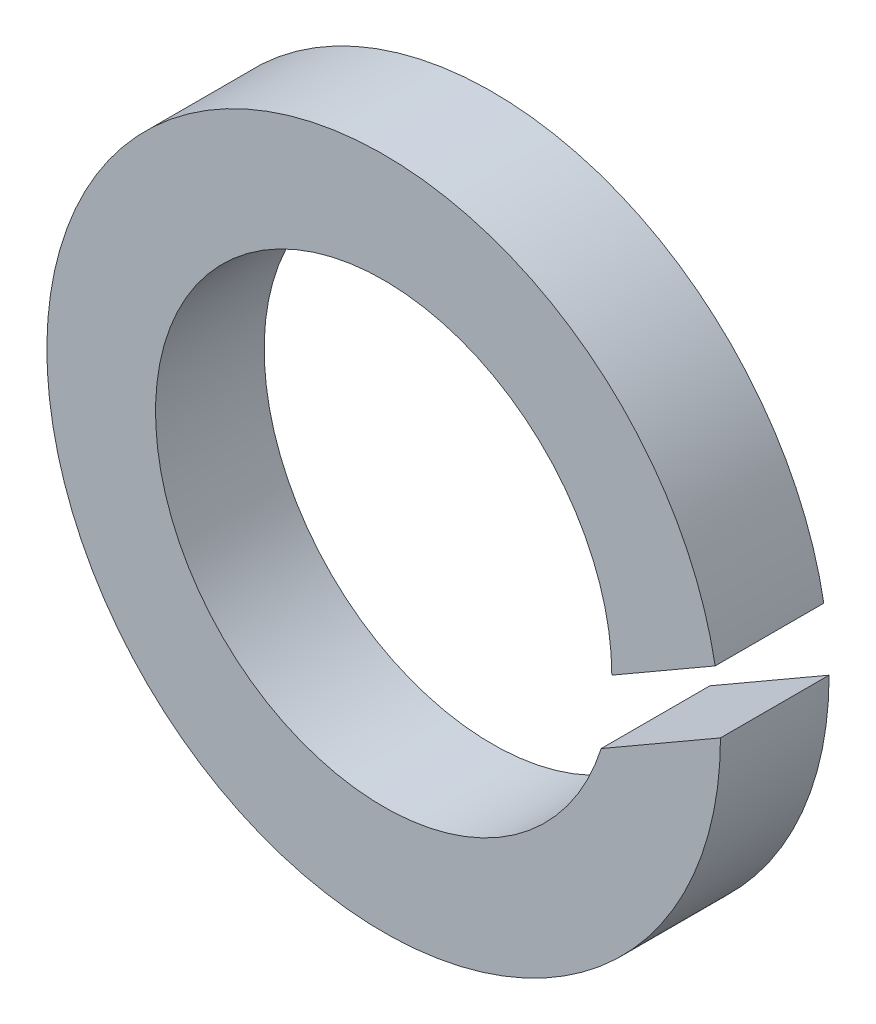
ISO-10303-21;
HEADER;
FILE_DESCRIPTION(('STEP AP214'),'2;1');
FILE_NAME('part.step','',(''),(''),'','','');
FILE_SCHEMA(('AUTOMOTIVE_DESIGN { 1 0 10303 214 1 1 1 1 }'));
ENDSEC;
DATA;
#1=APPLICATION_CONTEXT('core data for automotive mechanical design processes');
#2=APPLICATION_PROTOCOL_DEFINITION('international standard','automotive_design',2000,#1);
#3=PRODUCT_CONTEXT('',#1,'mechanical');
#4=PRODUCT('Part','Part','',(#3));
#5=PRODUCT_RELATED_PRODUCT_CATEGORY('part','',(#4));
#6=PRODUCT_DEFINITION_FORMATION('','',#4);
#7=PRODUCT_DEFINITION_CONTEXT('part definition',#1,'design');
#8=PRODUCT_DEFINITION('design','',#6,#7);
#9=PRODUCT_DEFINITION_SHAPE('','',#8);
#10=(LENGTH_UNIT() NAMED_UNIT(*) SI_UNIT(.MILLI.,.METRE.));
#11=(NAMED_UNIT(*) PLANE_ANGLE_UNIT() SI_UNIT($,.RADIAN.));
#12=(NAMED_UNIT(*) SI_UNIT($,.STERADIAN.) SOLID_ANGLE_UNIT());
#13=UNCERTAINTY_MEASURE_WITH_UNIT(LENGTH_MEASURE(1.E-05),#10,'distance_accuracy_value','');
#14=(GEOMETRIC_REPRESENTATION_CONTEXT(3) GLOBAL_UNCERTAINTY_ASSIGNED_CONTEXT((#13)) GLOBAL_UNIT_ASSIGNED_CONTEXT((#10,
#11,#12)) REPRESENTATION_CONTEXT('',''));
#15=CARTESIAN_POINT('',(0.,0.,0.));
#16=DIRECTION('',(0.,0.,1.));
#17=DIRECTION('',(1.,0.,0.));
#18=AXIS2_PLACEMENT_3D('',#15,#16,#17);
#19=CARTESIAN_POINT('',(0.,0.,0.5));
#20=DIRECTION('',(0.,0.,-1.));
#21=DIRECTION('',(-1.,0.,0.));
#22=AXIS2_PLACEMENT_3D('',#19,#20,#21);
#23=CYLINDRICAL_SURFACE('',#22,1.05);
#24=CARTESIAN_POINT('',(0.,0.,0.));
#25=DIRECTION('',(0.,0.,-1.));
#26=DIRECTION('',(1.,0.,0.));
#27=AXIS2_PLACEMENT_3D('',#24,#25,#26);
#28=CIRCLE('',#27,1.05);
#29=CARTESIAN_POINT('',(1.0010195595904,-0.316954005050321,0.));
#30=VERTEX_POINT('',#29);
#31=CARTESIAN_POINT('',(1.05,0.,0.));
#32=VERTEX_POINT('',#31);
#33=EDGE_CURVE('E94',#30,#32,#28,.T.);
#34=ORIENTED_EDGE('',*,*,#33,.T.);
#35=DIRECTION('',(0.,0.,-1.));
#36=VECTOR('',#35,1.);
#37=CARTESIAN_POINT('',(1.05,0.,0.5));
#38=LINE('',#37,#36);
#39=CARTESIAN_POINT('',(1.05,0.,0.5));
#40=VERTEX_POINT('',#39);
#41=EDGE_CURVE('E11',#40,#32,#38,.T.);
#42=ORIENTED_EDGE('',*,*,#41,.F.);
#43=CARTESIAN_POINT('',(0.,0.,0.5));
#44=DIRECTION('',(0.,0.,-1.));
#45=DIRECTION('',(1.,0.,0.));
#46=AXIS2_PLACEMENT_3D('',#43,#44,#45);
#47=CIRCLE('',#46,1.05);
#48=CARTESIAN_POINT('',(1.0010195595904,-0.316954005050321,0.5));
#49=VERTEX_POINT('',#48);
#50=EDGE_CURVE('E82',#49,#40,#47,.T.);
#51=ORIENTED_EDGE('',*,*,#50,.F.);
#52=DIRECTION('',(0.,0.,-1.));
#53=VECTOR('',#52,1.);
#54=CARTESIAN_POINT('',(1.0010195595904,-0.316954005050321,0.5));
#55=LINE('',#54,#53);
#56=EDGE_CURVE('E90',#49,#30,#55,.T.);
#57=ORIENTED_EDGE('',*,*,#56,.T.);
#58=EDGE_LOOP('',(#34,#42,#51,#57));
#59=FACE_BOUND('',#58,.T.);
#60=ADVANCED_FACE('F31',(#59),#23,.F.);
#61=CARTESIAN_POINT('',(1.05,0.,0.5));
#62=DIRECTION('',(-0.5,0.866025403784439,0.));
#63=DIRECTION('',(-0.866025403784439,-0.5,0.));
#64=AXIS2_PLACEMENT_3D('',#61,#62,#63);
#65=PLANE('',#64);
#66=DIRECTION('',(0.866025403784439,0.5,0.));
#67=VECTOR('',#66,1.);
#68=CARTESIAN_POINT('',(1.05,0.,0.));
#69=LINE('',#68,#67);
#70=CARTESIAN_POINT('',(1.52549495248398,0.274527138814932,0.));
#71=VERTEX_POINT('',#70);
#72=EDGE_CURVE('E86',#32,#71,#69,.T.);
#73=ORIENTED_EDGE('',*,*,#72,.T.);
#74=DIRECTION('',(0.,0.,-1.));
#75=VECTOR('',#74,1.);
#76=CARTESIAN_POINT('',(1.52549495248398,0.274527138814932,0.5));
#77=LINE('',#76,#75);
#78=CARTESIAN_POINT('',(1.52549495248398,0.274527138814932,0.5));
#79=VERTEX_POINT('',#78);
#80=EDGE_CURVE('E39',#79,#71,#77,.T.);
#81=ORIENTED_EDGE('',*,*,#80,.F.);
#82=DIRECTION('',(0.866025403784439,0.5,0.));
#83=VECTOR('',#82,1.);
#84=CARTESIAN_POINT('',(1.05,0.,0.5));
#85=LINE('',#84,#83);
#86=EDGE_CURVE('E77',#40,#79,#85,.T.);
#87=ORIENTED_EDGE('',*,*,#86,.F.);
#88=ORIENTED_EDGE('',*,*,#41,.T.);
#89=EDGE_LOOP('',(#73,#81,#87,#88));
#90=FACE_BOUND('',#89,.T.);
#91=ADVANCED_FACE('F85',(#90),#65,.F.);
#92=CARTESIAN_POINT('',(0.,0.,0.5));
#93=DIRECTION('',(0.,0.,-1.));
#94=DIRECTION('',(-1.,0.,0.));
#95=AXIS2_PLACEMENT_3D('',#92,#93,#94);
#96=CYLINDRICAL_SURFACE('',#95,1.55);
#97=CARTESIAN_POINT('',(0.,0.,0.));
#98=DIRECTION('',(0.,0.,1.));
#99=DIRECTION('',(1.,0.,0.));
#100=AXIS2_PLACEMENT_3D('',#97,#98,#99);
#101=CIRCLE('',#100,1.55);
#102=CARTESIAN_POINT('',(1.55,0.,0.));
#103=VERTEX_POINT('',#102);
#104=EDGE_CURVE('E64',#71,#103,#101,.T.);
#105=ORIENTED_EDGE('',*,*,#104,.T.);
#106=DIRECTION('',(0.,0.,-1.));
#107=VECTOR('',#106,1.);
#108=CARTESIAN_POINT('',(1.55,0.,0.5));
#109=LINE('',#108,#107);
#110=CARTESIAN_POINT('',(1.55,0.,0.5));
#111=VERTEX_POINT('',#110);
#112=EDGE_CURVE('E87',#111,#103,#109,.T.);
#113=ORIENTED_EDGE('',*,*,#112,.F.);
#114=CARTESIAN_POINT('',(0.,0.,0.5));
#115=DIRECTION('',(0.,0.,1.));
#116=DIRECTION('',(1.,0.,0.));
#117=AXIS2_PLACEMENT_3D('',#114,#115,#116);
#118=CIRCLE('',#117,1.55);
#119=EDGE_CURVE('E80',#79,#111,#118,.T.);
#120=ORIENTED_EDGE('',*,*,#119,.F.);
#121=ORIENTED_EDGE('',*,*,#80,.T.);
#122=EDGE_LOOP('',(#105,#113,#120,#121));
#123=FACE_BOUND('',#122,.T.);
#124=ADVANCED_FACE('F88',(#123),#96,.T.);
#125=CARTESIAN_POINT('',(1.0010195595904,-0.316954005050321,0.5));
#126=DIRECTION('',(0.5,-0.866025403784439,0.));
#127=DIRECTION('',(0.866025403784439,0.5,0.));
#128=AXIS2_PLACEMENT_3D('',#125,#126,#127);
#129=PLANE('',#128);
#130=DIRECTION('',(-0.866025403784439,-0.5,0.));
#131=VECTOR('',#130,1.);
#132=CARTESIAN_POINT('',(1.0010195595904,-0.316954005050321,0.));
#133=LINE('',#132,#131);
#134=EDGE_CURVE('E70',#103,#30,#133,.T.);
#135=ORIENTED_EDGE('',*,*,#134,.T.);
#136=ORIENTED_EDGE('',*,*,#56,.F.);
#137=DIRECTION('',(-0.866025403784439,-0.5,0.));
#138=VECTOR('',#137,1.);
#139=CARTESIAN_POINT('',(1.0010195595904,-0.316954005050321,0.5));
#140=LINE('',#139,#138);
#141=EDGE_CURVE('E47',#111,#49,#140,.T.);
#142=ORIENTED_EDGE('',*,*,#141,.F.);
#143=ORIENTED_EDGE('',*,*,#112,.T.);
#144=EDGE_LOOP('',(#135,#136,#142,#143));
#145=FACE_BOUND('',#144,.T.);
#146=ADVANCED_FACE('F101',(#145),#129,.F.);
#147=CARTESIAN_POINT('',(0.,0.,0.5));
#148=DIRECTION('',(0.,0.,1.));
#149=DIRECTION('',(1.,0.,0.));
#150=AXIS2_PLACEMENT_3D('',#147,#148,#149);
#151=PLANE('',#150);
#152=ORIENTED_EDGE('',*,*,#50,.T.);
#153=ORIENTED_EDGE('',*,*,#86,.T.);
#154=ORIENTED_EDGE('',*,*,#119,.T.);
#155=ORIENTED_EDGE('',*,*,#141,.T.);
#156=EDGE_LOOP('',(#152,#153,#154,#155));
#157=FACE_BOUND('',#156,.T.);
#158=ADVANCED_FACE('F78',(#157),#151,.T.);
#159=CARTESIAN_POINT('',(0.,0.,0.));
#160=DIRECTION('',(0.,0.,1.));
#161=DIRECTION('',(1.,0.,0.));
#162=AXIS2_PLACEMENT_3D('',#159,#160,#161);
#163=PLANE('',#162);
#164=ORIENTED_EDGE('',*,*,#33,.F.);
#165=ORIENTED_EDGE('',*,*,#134,.F.);
#166=ORIENTED_EDGE('',*,*,#104,.F.);
#167=ORIENTED_EDGE('',*,*,#72,.F.);
#168=EDGE_LOOP('',(#164,#165,#166,#167));
#169=FACE_BOUND('',#168,.T.);
#170=ADVANCED_FACE('F104',(#169),#163,.F.);
#171=CLOSED_SHELL('',(#60,#91,#124,#146,#158,#170));
#172=MANIFOLD_SOLID_BREP('B2',#171);
#173=ADVANCED_BREP_SHAPE_REPRESENTATION('',(#18,#172),#14);
#174=SHAPE_DEFINITION_REPRESENTATION(#9,#173);
ENDSEC;
END-ISO-10303-21;
